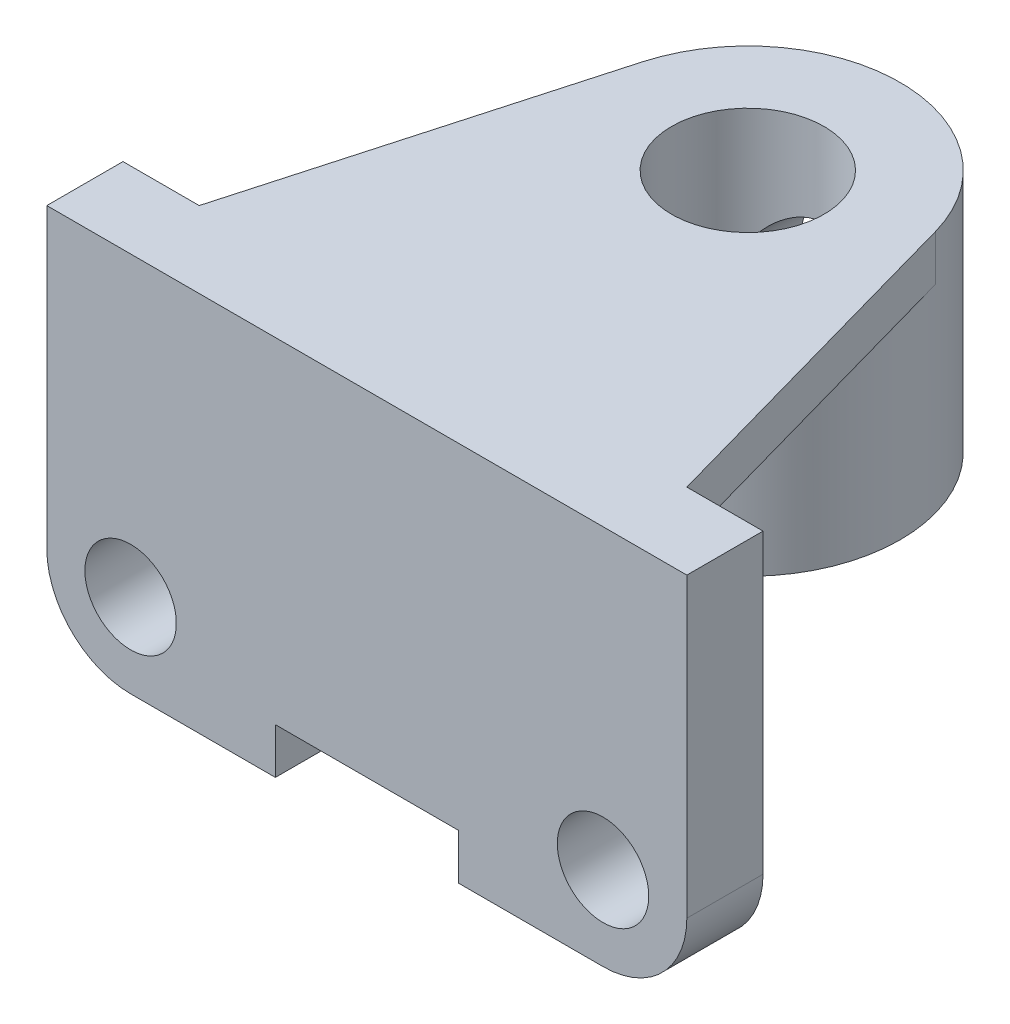
ISO-10303-21;
HEADER;
FILE_DESCRIPTION(('STEP AP214'),'2;1');
FILE_NAME('part.step','',(''),(''),'','','');
FILE_SCHEMA(('AUTOMOTIVE_DESIGN { 1 0 10303 214 1 1 1 1 }'));
ENDSEC;
DATA;
#1=APPLICATION_CONTEXT('core data for automotive mechanical design processes');
#2=APPLICATION_PROTOCOL_DEFINITION('international standard','automotive_design',2000,#1);
#3=PRODUCT_CONTEXT('',#1,'mechanical');
#4=PRODUCT('Part','Part','',(#3));
#5=PRODUCT_RELATED_PRODUCT_CATEGORY('part','',(#4));
#6=PRODUCT_DEFINITION_FORMATION('','',#4);
#7=PRODUCT_DEFINITION_CONTEXT('part definition',#1,'design');
#8=PRODUCT_DEFINITION('design','',#6,#7);
#9=PRODUCT_DEFINITION_SHAPE('','',#8);
#10=(LENGTH_UNIT() NAMED_UNIT(*) SI_UNIT(.MILLI.,.METRE.));
#11=(NAMED_UNIT(*) PLANE_ANGLE_UNIT() SI_UNIT($,.RADIAN.));
#12=(NAMED_UNIT(*) SI_UNIT($,.STERADIAN.) SOLID_ANGLE_UNIT());
#13=UNCERTAINTY_MEASURE_WITH_UNIT(LENGTH_MEASURE(1.E-05),#10,'distance_accuracy_value','');
#14=(GEOMETRIC_REPRESENTATION_CONTEXT(3) GLOBAL_UNCERTAINTY_ASSIGNED_CONTEXT((#13)) GLOBAL_UNIT_ASSIGNED_CONTEXT((#10,
#11,#12)) REPRESENTATION_CONTEXT('',''));
#15=CARTESIAN_POINT('',(0.,0.,0.));
#16=DIRECTION('',(0.,0.,1.));
#17=DIRECTION('',(1.,0.,0.));
#18=AXIS2_PLACEMENT_3D('',#15,#16,#17);
#19=CARTESIAN_POINT('',(31.,-39.,0.));
#20=DIRECTION('',(0.,0.,1.));
#21=DIRECTION('',(1.,0.,0.));
#22=AXIS2_PLACEMENT_3D('',#19,#20,#21);
#23=PLANE('',#22);
#24=CARTESIAN_POINT('',(31.,-39.,0.));
#25=DIRECTION('',(0.,0.,1.));
#26=DIRECTION('',(1.,0.,0.));
#27=AXIS2_PLACEMENT_3D('',#24,#25,#26);
#28=CIRCLE('',#27,6.);
#29=CARTESIAN_POINT('',(37.,-39.,0.));
#30=VERTEX_POINT('',#29);
#31=EDGE_CURVE('E318',#30,#30,#28,.T.);
#32=ORIENTED_EDGE('',*,*,#31,.T.);
#33=EDGE_LOOP('',(#32));
#34=FACE_BOUND('',#33,.T.);
#35=CARTESIAN_POINT('',(-31.,-39.,0.));
#36=DIRECTION('',(0.,0.,1.));
#37=DIRECTION('',(-1.,0.,0.));
#38=AXIS2_PLACEMENT_3D('',#35,#36,#37);
#39=CIRCLE('',#38,6.);
#40=CARTESIAN_POINT('',(-37.,-39.,0.));
#41=VERTEX_POINT('',#40);
#42=EDGE_CURVE('E309',#41,#41,#39,.T.);
#43=ORIENTED_EDGE('',*,*,#42,.T.);
#44=EDGE_LOOP('',(#43));
#45=FACE_BOUND('',#44,.T.);
#46=DIRECTION('',(0.,1.,0.));
#47=VECTOR('',#46,1.);
#48=CARTESIAN_POINT('',(3.00000000000001,-32.,0.));
#49=LINE('',#48,#47);
#50=CARTESIAN_POINT('',(3.00000000000001,-32.,0.));
#51=VERTEX_POINT('',#50);
#52=CARTESIAN_POINT('',(3.,-6.,0.));
#53=VERTEX_POINT('',#52);
#54=EDGE_CURVE('E359',#51,#53,#49,.T.);
#55=ORIENTED_EDGE('',*,*,#54,.T.);
#56=DIRECTION('',(-1.,0.,0.));
#57=VECTOR('',#56,1.);
#58=CARTESIAN_POINT('',(0.,-6.,0.));
#59=LINE('',#58,#57);
#60=CARTESIAN_POINT('',(32.,-6.,0.));
#61=VERTEX_POINT('',#60);
#62=EDGE_CURVE('E346',#61,#53,#59,.T.);
#63=ORIENTED_EDGE('',*,*,#62,.F.);
#64=DIRECTION('',(0.,1.,0.));
#65=VECTOR('',#64,1.);
#66=CARTESIAN_POINT('',(32.,-6.,0.));
#67=LINE('',#66,#65);
#68=CARTESIAN_POINT('',(32.,0.,0.));
#69=VERTEX_POINT('',#68);
#70=EDGE_CURVE('E334',#61,#69,#67,.T.);
#71=ORIENTED_EDGE('',*,*,#70,.T.);
#72=DIRECTION('',(-1.,0.,0.));
#73=VECTOR('',#72,1.);
#74=CARTESIAN_POINT('',(-42.,0.,0.));
#75=LINE('',#74,#73);
#76=CARTESIAN_POINT('',(42.,0.,0.));
#77=VERTEX_POINT('',#76);
#78=EDGE_CURVE('E184',#77,#69,#75,.T.);
#79=ORIENTED_EDGE('',*,*,#78,.F.);
#80=DIRECTION('',(0.,1.,0.));
#81=VECTOR('',#80,1.);
#82=CARTESIAN_POINT('',(42.,-39.,0.));
#83=LINE('',#82,#81);
#84=CARTESIAN_POINT('',(42.,-39.,0.));
#85=VERTEX_POINT('',#84);
#86=EDGE_CURVE('E179',#85,#77,#83,.T.);
#87=ORIENTED_EDGE('',*,*,#86,.F.);
#88=CARTESIAN_POINT('',(31.,-39.,0.));
#89=DIRECTION('',(0.,0.,1.));
#90=DIRECTION('',(1.,0.,0.));
#91=AXIS2_PLACEMENT_3D('',#88,#89,#90);
#92=CIRCLE('',#91,11.);
#93=CARTESIAN_POINT('',(31.,-50.,0.));
#94=VERTEX_POINT('',#93);
#95=EDGE_CURVE('E175',#94,#85,#92,.T.);
#96=ORIENTED_EDGE('',*,*,#95,.F.);
#97=DIRECTION('',(1.,0.,0.));
#98=VECTOR('',#97,1.);
#99=CARTESIAN_POINT('',(12.,-50.,0.));
#100=LINE('',#99,#98);
#101=CARTESIAN_POINT('',(12.,-50.,0.));
#102=VERTEX_POINT('',#101);
#103=EDGE_CURVE('E111',#102,#94,#100,.T.);
#104=ORIENTED_EDGE('',*,*,#103,.F.);
#105=DIRECTION('',(0.,-1.,0.));
#106=VECTOR('',#105,1.);
#107=CARTESIAN_POINT('',(12.,-50.,0.));
#108=LINE('',#107,#106);
#109=CARTESIAN_POINT('',(12.,-44.,0.));
#110=VERTEX_POINT('',#109);
#111=EDGE_CURVE('E202',#110,#102,#108,.T.);
#112=ORIENTED_EDGE('',*,*,#111,.F.);
#113=DIRECTION('',(1.,0.,0.));
#114=VECTOR('',#113,1.);
#115=CARTESIAN_POINT('',(-12.,-44.,0.));
#116=LINE('',#115,#114);
#117=CARTESIAN_POINT('',(-12.,-44.,0.));
#118=VERTEX_POINT('',#117);
#119=EDGE_CURVE('E160',#118,#110,#116,.T.);
#120=ORIENTED_EDGE('',*,*,#119,.F.);
#121=DIRECTION('',(0.,1.,0.));
#122=VECTOR('',#121,1.);
#123=CARTESIAN_POINT('',(-12.,-50.,0.));
#124=LINE('',#123,#122);
#125=CARTESIAN_POINT('',(-12.,-50.,0.));
#126=VERTEX_POINT('',#125);
#127=EDGE_CURVE('E197',#126,#118,#124,.T.);
#128=ORIENTED_EDGE('',*,*,#127,.F.);
#129=DIRECTION('',(1.,0.,0.));
#130=VECTOR('',#129,1.);
#131=CARTESIAN_POINT('',(-31.,-50.,0.));
#132=LINE('',#131,#130);
#133=CARTESIAN_POINT('',(-31.,-50.,0.));
#134=VERTEX_POINT('',#133);
#135=EDGE_CURVE('E194',#134,#126,#132,.T.);
#136=ORIENTED_EDGE('',*,*,#135,.F.);
#137=CARTESIAN_POINT('',(-31.,-39.,0.));
#138=DIRECTION('',(0.,0.,1.));
#139=DIRECTION('',(-1.,0.,0.));
#140=AXIS2_PLACEMENT_3D('',#137,#138,#139);
#141=CIRCLE('',#140,11.);
#142=CARTESIAN_POINT('',(-42.,-39.,0.));
#143=VERTEX_POINT('',#142);
#144=EDGE_CURVE('E191',#143,#134,#141,.T.);
#145=ORIENTED_EDGE('',*,*,#144,.F.);
#146=DIRECTION('',(0.,-1.,0.));
#147=VECTOR('',#146,1.);
#148=CARTESIAN_POINT('',(-42.,-39.,0.));
#149=LINE('',#148,#147);
#150=CARTESIAN_POINT('',(-42.,0.,0.));
#151=VERTEX_POINT('',#150);
#152=EDGE_CURVE('E188',#151,#143,#149,.T.);
#153=ORIENTED_EDGE('',*,*,#152,.F.);
#154=CARTESIAN_POINT('',(-32.,0.,0.));
#155=VERTEX_POINT('',#154);
#156=EDGE_CURVE('E183',#155,#151,#75,.T.);
#157=ORIENTED_EDGE('',*,*,#156,.F.);
#158=DIRECTION('',(0.,1.,0.));
#159=VECTOR('',#158,1.);
#160=CARTESIAN_POINT('',(-32.,-6.,0.));
#161=LINE('',#160,#159);
#162=CARTESIAN_POINT('',(-32.,-6.,0.));
#163=VERTEX_POINT('',#162);
#164=EDGE_CURVE('E305',#163,#155,#161,.T.);
#165=ORIENTED_EDGE('',*,*,#164,.F.);
#166=CARTESIAN_POINT('',(-3.,-6.,0.));
#167=VERTEX_POINT('',#166);
#168=EDGE_CURVE('E350',#167,#163,#59,.T.);
#169=ORIENTED_EDGE('',*,*,#168,.F.);
#170=DIRECTION('',(0.,1.,0.));
#171=VECTOR('',#170,1.);
#172=CARTESIAN_POINT('',(-3.,-32.,0.));
#173=LINE('',#172,#171);
#174=CARTESIAN_POINT('',(-3.,-32.,0.));
#175=VERTEX_POINT('',#174);
#176=EDGE_CURVE('E362',#175,#167,#173,.T.);
#177=ORIENTED_EDGE('',*,*,#176,.F.);
#178=DIRECTION('',(-1.,0.,0.));
#179=VECTOR('',#178,1.);
#180=CARTESIAN_POINT('',(0.,-32.,0.));
#181=LINE('',#180,#179);
#182=EDGE_CURVE('E379',#51,#175,#181,.T.);
#183=ORIENTED_EDGE('',*,*,#182,.F.);
#184=EDGE_LOOP('',(#55,#63,#71,#79,#87,#96,#104,#112,#120,#128,#136,#145,#153,#157,#165,#169,
#177,#183));
#185=FACE_BOUND('',#184,.T.);
#186=ADVANCED_FACE('F47',(#34,#45,#185),#23,.F.);
#187=CARTESIAN_POINT('',(0.,-6.,0.));
#188=DIRECTION('',(0.,1.,0.));
#189=DIRECTION('',(-1.,0.,0.));
#190=AXIS2_PLACEMENT_3D('',#187,#188,#189);
#191=PLANE('',#190);
#192=CARTESIAN_POINT('',(0.,-6.,-40.));
#193=DIRECTION('',(0.,1.,0.));
#194=DIRECTION('',(-1.,0.,0.));
#195=AXIS2_PLACEMENT_3D('',#192,#193,#194);
#196=CIRCLE('',#195,20.);
#197=CARTESIAN_POINT('',(-19.2558855153069,-6.,-45.4047084122455));
#198=VERTEX_POINT('',#197);
#199=CARTESIAN_POINT('',(-3.,-6.,-20.2262800667148));
#200=VERTEX_POINT('',#199);
#201=EDGE_CURVE('E56',#198,#200,#196,.T.);
#202=ORIENTED_EDGE('',*,*,#201,.T.);
#203=DIRECTION('',(0.,0.,1.));
#204=VECTOR('',#203,1.);
#205=CARTESIAN_POINT('',(-3.,-6.,0.));
#206=LINE('',#205,#204);
#207=EDGE_CURVE('E11',#200,#167,#206,.T.);
#208=ORIENTED_EDGE('',*,*,#207,.T.);
#209=ORIENTED_EDGE('',*,*,#168,.T.);
#210=DIRECTION('',(0.270235420612273,0.,-0.962794275765341));
#211=VECTOR('',#210,1.);
#212=CARTESIAN_POINT('',(-29.6631301582883,-6.,-8.32579571438513));
#213=LINE('',#212,#211);
#214=EDGE_CURVE('E261',#163,#198,#213,.T.);
#215=ORIENTED_EDGE('',*,*,#214,.T.);
#216=EDGE_LOOP('',(#202,#208,#209,#215));
#217=FACE_BOUND('',#216,.T.);
#218=ADVANCED_FACE('F254',(#217),#191,.F.);
#219=DIRECTION('',(0.,0.,1.));
#220=VECTOR('',#219,1.);
#221=CARTESIAN_POINT('',(3.,-6.,0.));
#222=LINE('',#221,#220);
#223=CARTESIAN_POINT('',(3.,-6.,-20.2262800667148));
#224=VERTEX_POINT('',#223);
#225=EDGE_CURVE('E241',#224,#53,#222,.T.);
#226=ORIENTED_EDGE('',*,*,#225,.F.);
#227=CARTESIAN_POINT('',(0.,-6.,-40.));
#228=DIRECTION('',(0.,1.,0.));
#229=DIRECTION('',(-1.,0.,0.));
#230=AXIS2_PLACEMENT_3D('',#227,#228,#229);
#231=CIRCLE('',#230,20.);
#232=CARTESIAN_POINT('',(19.2558855153068,-6.,-45.4047084122455));
#233=VERTEX_POINT('',#232);
#234=EDGE_CURVE('E237',#224,#233,#231,.T.);
#235=ORIENTED_EDGE('',*,*,#234,.T.);
#236=DIRECTION('',(-0.270235420612273,0.,-0.962794275765341));
#237=VECTOR('',#236,1.);
#238=CARTESIAN_POINT('',(29.6631301582883,-6.,-8.32579571438513));
#239=LINE('',#238,#237);
#240=EDGE_CURVE('E342',#61,#233,#239,.T.);
#241=ORIENTED_EDGE('',*,*,#240,.F.);
#242=ORIENTED_EDGE('',*,*,#62,.T.);
#243=EDGE_LOOP('',(#226,#235,#241,#242));
#244=FACE_BOUND('',#243,.T.);
#245=ADVANCED_FACE('F446',(#244),#191,.F.);
#246=CARTESIAN_POINT('',(31.,-39.,10.));
#247=DIRECTION('',(0.,0.,1.));
#248=DIRECTION('',(1.,0.,0.));
#249=AXIS2_PLACEMENT_3D('',#246,#247,#248);
#250=PLANE('',#249);
#251=CARTESIAN_POINT('',(31.,-39.,10.));
#252=DIRECTION('',(0.,0.,1.));
#253=DIRECTION('',(1.,0.,0.));
#254=AXIS2_PLACEMENT_3D('',#251,#252,#253);
#255=CIRCLE('',#254,6.);
#256=CARTESIAN_POINT('',(37.,-39.,10.));
#257=VERTEX_POINT('',#256);
#258=EDGE_CURVE('E180',#257,#257,#255,.T.);
#259=ORIENTED_EDGE('',*,*,#258,.F.);
#260=EDGE_LOOP('',(#259));
#261=FACE_BOUND('',#260,.T.);
#262=CARTESIAN_POINT('',(31.,-39.,10.));
#263=DIRECTION('',(0.,0.,1.));
#264=DIRECTION('',(1.,0.,0.));
#265=AXIS2_PLACEMENT_3D('',#262,#263,#264);
#266=CIRCLE('',#265,11.);
#267=CARTESIAN_POINT('',(31.,-50.,10.));
#268=VERTEX_POINT('',#267);
#269=CARTESIAN_POINT('',(42.,-39.,10.));
#270=VERTEX_POINT('',#269);
#271=EDGE_CURVE('E207',#268,#270,#266,.T.);
#272=ORIENTED_EDGE('',*,*,#271,.T.);
#273=DIRECTION('',(0.,1.,0.));
#274=VECTOR('',#273,1.);
#275=CARTESIAN_POINT('',(42.,-39.,10.));
#276=LINE('',#275,#274);
#277=CARTESIAN_POINT('',(42.,0.,10.));
#278=VERTEX_POINT('',#277);
#279=EDGE_CURVE('E120',#270,#278,#276,.T.);
#280=ORIENTED_EDGE('',*,*,#279,.T.);
#281=DIRECTION('',(-1.,0.,0.));
#282=VECTOR('',#281,1.);
#283=CARTESIAN_POINT('',(-42.,0.,10.));
#284=LINE('',#283,#282);
#285=CARTESIAN_POINT('',(-42.,0.,10.));
#286=VERTEX_POINT('',#285);
#287=EDGE_CURVE('E505',#278,#286,#284,.T.);
#288=ORIENTED_EDGE('',*,*,#287,.T.);
#289=DIRECTION('',(0.,-1.,0.));
#290=VECTOR('',#289,1.);
#291=CARTESIAN_POINT('',(-42.,-39.,10.));
#292=LINE('',#291,#290);
#293=CARTESIAN_POINT('',(-42.,-39.,10.));
#294=VERTEX_POINT('',#293);
#295=EDGE_CURVE('E749',#286,#294,#292,.T.);
#296=ORIENTED_EDGE('',*,*,#295,.T.);
#297=CARTESIAN_POINT('',(-31.,-39.,10.));
#298=DIRECTION('',(0.,0.,1.));
#299=DIRECTION('',(-1.,0.,0.));
#300=AXIS2_PLACEMENT_3D('',#297,#298,#299);
#301=CIRCLE('',#300,11.);
#302=CARTESIAN_POINT('',(-31.,-50.,10.));
#303=VERTEX_POINT('',#302);
#304=EDGE_CURVE('E753',#294,#303,#301,.T.);
#305=ORIENTED_EDGE('',*,*,#304,.T.);
#306=DIRECTION('',(1.,0.,0.));
#307=VECTOR('',#306,1.);
#308=CARTESIAN_POINT('',(-31.,-50.,10.));
#309=LINE('',#308,#307);
#310=CARTESIAN_POINT('',(-12.,-50.,10.));
#311=VERTEX_POINT('',#310);
#312=EDGE_CURVE('E760',#303,#311,#309,.T.);
#313=ORIENTED_EDGE('',*,*,#312,.T.);
#314=DIRECTION('',(0.,1.,0.));
#315=VECTOR('',#314,1.);
#316=CARTESIAN_POINT('',(-12.,-50.,10.));
#317=LINE('',#316,#315);
#318=CARTESIAN_POINT('',(-12.,-44.,10.));
#319=VERTEX_POINT('',#318);
#320=EDGE_CURVE('E150',#311,#319,#317,.T.);
#321=ORIENTED_EDGE('',*,*,#320,.T.);
#322=DIRECTION('',(1.,0.,0.));
#323=VECTOR('',#322,1.);
#324=CARTESIAN_POINT('',(-12.,-44.,10.));
#325=LINE('',#324,#323);
#326=CARTESIAN_POINT('',(12.,-44.,10.));
#327=VERTEX_POINT('',#326);
#328=EDGE_CURVE('E142',#319,#327,#325,.T.);
#329=ORIENTED_EDGE('',*,*,#328,.T.);
#330=DIRECTION('',(0.,-1.,0.));
#331=VECTOR('',#330,1.);
#332=CARTESIAN_POINT('',(12.,-50.,10.));
#333=LINE('',#332,#331);
#334=CARTESIAN_POINT('',(12.,-50.,10.));
#335=VERTEX_POINT('',#334);
#336=EDGE_CURVE('E147',#327,#335,#333,.T.);
#337=ORIENTED_EDGE('',*,*,#336,.T.);
#338=DIRECTION('',(1.,0.,0.));
#339=VECTOR('',#338,1.);
#340=CARTESIAN_POINT('',(12.,-50.,10.));
#341=LINE('',#340,#339);
#342=EDGE_CURVE('E72',#335,#268,#341,.T.);
#343=ORIENTED_EDGE('',*,*,#342,.T.);
#344=EDGE_LOOP('',(#272,#280,#288,#296,#305,#313,#321,#329,#337,#343));
#345=FACE_BOUND('',#344,.T.);
#346=CARTESIAN_POINT('',(-31.,-39.,10.));
#347=DIRECTION('',(0.,0.,1.));
#348=DIRECTION('',(-1.,0.,0.));
#349=AXIS2_PLACEMENT_3D('',#346,#347,#348);
#350=CIRCLE('',#349,6.);
#351=CARTESIAN_POINT('',(-37.,-39.,10.));
#352=VERTEX_POINT('',#351);
#353=EDGE_CURVE('E322',#352,#352,#350,.T.);
#354=ORIENTED_EDGE('',*,*,#353,.F.);
#355=EDGE_LOOP('',(#354));
#356=FACE_BOUND('',#355,.T.);
#357=ADVANCED_FACE('F144',(#261,#345,#356),#250,.T.);
#358=CARTESIAN_POINT('',(31.,-39.,10.));
#359=DIRECTION('',(0.,0.,-1.));
#360=DIRECTION('',(-1.,0.,0.));
#361=AXIS2_PLACEMENT_3D('',#358,#359,#360);
#362=CYLINDRICAL_SURFACE('',#361,11.);
#363=ORIENTED_EDGE('',*,*,#95,.T.);
#364=DIRECTION('',(0.,0.,-1.));
#365=VECTOR('',#364,1.);
#366=CARTESIAN_POINT('',(42.,-39.,10.));
#367=LINE('',#366,#365);
#368=EDGE_CURVE('E234',#270,#85,#367,.T.);
#369=ORIENTED_EDGE('',*,*,#368,.F.);
#370=ORIENTED_EDGE('',*,*,#271,.F.);
#371=DIRECTION('',(0.,0.,-1.));
#372=VECTOR('',#371,1.);
#373=CARTESIAN_POINT('',(31.,-50.,10.));
#374=LINE('',#373,#372);
#375=EDGE_CURVE('E171',#268,#94,#374,.T.);
#376=ORIENTED_EDGE('',*,*,#375,.T.);
#377=EDGE_LOOP('',(#363,#369,#370,#376));
#378=FACE_BOUND('',#377,.T.);
#379=ADVANCED_FACE('F49',(#378),#362,.T.);
#380=CARTESIAN_POINT('',(42.,-39.,10.));
#381=DIRECTION('',(-1.,0.,0.));
#382=DIRECTION('',(0.,-1.,0.));
#383=AXIS2_PLACEMENT_3D('',#380,#381,#382);
#384=PLANE('',#383);
#385=ORIENTED_EDGE('',*,*,#86,.T.);
#386=DIRECTION('',(0.,0.,-1.));
#387=VECTOR('',#386,1.);
#388=CARTESIAN_POINT('',(42.,0.,10.));
#389=LINE('',#388,#387);
#390=EDGE_CURVE('E230',#278,#77,#389,.T.);
#391=ORIENTED_EDGE('',*,*,#390,.F.);
#392=ORIENTED_EDGE('',*,*,#279,.F.);
#393=ORIENTED_EDGE('',*,*,#368,.T.);
#394=EDGE_LOOP('',(#385,#391,#392,#393));
#395=FACE_BOUND('',#394,.T.);
#396=ADVANCED_FACE('F495',(#395),#384,.F.);
#397=CARTESIAN_POINT('',(-42.,0.,10.));
#398=DIRECTION('',(0.,-1.,0.));
#399=DIRECTION('',(1.,0.,0.));
#400=AXIS2_PLACEMENT_3D('',#397,#398,#399);
#401=PLANE('',#400);
#402=CARTESIAN_POINT('',(0.,0.,-40.));
#403=DIRECTION('',(0.,1.,0.));
#404=DIRECTION('',(-1.,0.,0.));
#405=AXIS2_PLACEMENT_3D('',#402,#403,#404);
#406=CIRCLE('',#405,20.);
#407=CARTESIAN_POINT('',(19.2558855153068,0.,-45.4047084122455));
#408=VERTEX_POINT('',#407);
#409=CARTESIAN_POINT('',(-19.2558855153068,0.,-45.4047084122455));
#410=VERTEX_POINT('',#409);
#411=EDGE_CURVE('E293',#408,#410,#406,.T.);
#412=ORIENTED_EDGE('',*,*,#411,.T.);
#413=DIRECTION('',(0.270235420612273,0.,-0.962794275765341));
#414=VECTOR('',#413,1.);
#415=CARTESIAN_POINT('',(-29.6631301582883,0.,-8.32579571438513));
#416=LINE('',#415,#414);
#417=EDGE_CURVE('E294',#155,#410,#416,.T.);
#418=ORIENTED_EDGE('',*,*,#417,.F.);
#419=ORIENTED_EDGE('',*,*,#156,.T.);
#420=DIRECTION('',(0.,0.,-1.));
#421=VECTOR('',#420,1.);
#422=CARTESIAN_POINT('',(-42.,0.,10.));
#423=LINE('',#422,#421);
#424=EDGE_CURVE('E226',#286,#151,#423,.T.);
#425=ORIENTED_EDGE('',*,*,#424,.F.);
#426=ORIENTED_EDGE('',*,*,#287,.F.);
#427=ORIENTED_EDGE('',*,*,#390,.T.);
#428=ORIENTED_EDGE('',*,*,#78,.T.);
#429=DIRECTION('',(-0.270235420612273,0.,-0.962794275765341));
#430=VECTOR('',#429,1.);
#431=CARTESIAN_POINT('',(29.6631301582883,0.,-8.32579571438513));
#432=LINE('',#431,#430);
#433=EDGE_CURVE('E63',#69,#408,#432,.T.);
#434=ORIENTED_EDGE('',*,*,#433,.T.);
#435=EDGE_LOOP('',(#412,#418,#419,#425,#426,#427,#428,#434));
#436=FACE_BOUND('',#435,.T.);
#437=CARTESIAN_POINT('',(0.,0.,-40.));
#438=DIRECTION('',(0.,1.,0.));
#439=DIRECTION('',(-1.,0.,0.));
#440=AXIS2_PLACEMENT_3D('',#437,#438,#439);
#441=CIRCLE('',#440,10.);
#442=CARTESIAN_POINT('',(-10.,0.,-40.));
#443=VERTEX_POINT('',#442);
#444=EDGE_CURVE('E302',#443,#443,#441,.T.);
#445=ORIENTED_EDGE('',*,*,#444,.F.);
#446=EDGE_LOOP('',(#445));
#447=FACE_BOUND('',#446,.T.);
#448=ADVANCED_FACE('F296',(#436,#447),#401,.F.);
#449=CARTESIAN_POINT('',(-42.,-39.,10.));
#450=DIRECTION('',(1.,0.,0.));
#451=DIRECTION('',(0.,0.,-1.));
#452=AXIS2_PLACEMENT_3D('',#449,#450,#451);
#453=PLANE('',#452);
#454=ORIENTED_EDGE('',*,*,#152,.T.);
#455=DIRECTION('',(0.,0.,-1.));
#456=VECTOR('',#455,1.);
#457=CARTESIAN_POINT('',(-42.,-39.,10.));
#458=LINE('',#457,#456);
#459=EDGE_CURVE('E222',#294,#143,#458,.T.);
#460=ORIENTED_EDGE('',*,*,#459,.F.);
#461=ORIENTED_EDGE('',*,*,#295,.F.);
#462=ORIENTED_EDGE('',*,*,#424,.T.);
#463=EDGE_LOOP('',(#454,#460,#461,#462));
#464=FACE_BOUND('',#463,.T.);
#465=ADVANCED_FACE('F489',(#464),#453,.F.);
#466=CARTESIAN_POINT('',(-31.,-39.,10.));
#467=DIRECTION('',(0.,0.,-1.));
#468=DIRECTION('',(-1.,0.,0.));
#469=AXIS2_PLACEMENT_3D('',#466,#467,#468);
#470=CYLINDRICAL_SURFACE('',#469,11.);
#471=ORIENTED_EDGE('',*,*,#144,.T.);
#472=DIRECTION('',(0.,0.,-1.));
#473=VECTOR('',#472,1.);
#474=CARTESIAN_POINT('',(-31.,-50.,10.));
#475=LINE('',#474,#473);
#476=EDGE_CURVE('E218',#303,#134,#475,.T.);
#477=ORIENTED_EDGE('',*,*,#476,.F.);
#478=ORIENTED_EDGE('',*,*,#304,.F.);
#479=ORIENTED_EDGE('',*,*,#459,.T.);
#480=EDGE_LOOP('',(#471,#477,#478,#479));
#481=FACE_BOUND('',#480,.T.);
#482=ADVANCED_FACE('F485',(#481),#470,.T.);
#483=CARTESIAN_POINT('',(-31.,-50.,10.));
#484=DIRECTION('',(0.,1.,0.));
#485=DIRECTION('',(-1.,0.,0.));
#486=AXIS2_PLACEMENT_3D('',#483,#484,#485);
#487=PLANE('',#486);
#488=ORIENTED_EDGE('',*,*,#135,.T.);
#489=DIRECTION('',(0.,0.,-1.));
#490=VECTOR('',#489,1.);
#491=CARTESIAN_POINT('',(-12.,-50.,10.));
#492=LINE('',#491,#490);
#493=EDGE_CURVE('E214',#311,#126,#492,.T.);
#494=ORIENTED_EDGE('',*,*,#493,.F.);
#495=ORIENTED_EDGE('',*,*,#312,.F.);
#496=ORIENTED_EDGE('',*,*,#476,.T.);
#497=EDGE_LOOP('',(#488,#494,#495,#496));
#498=FACE_BOUND('',#497,.T.);
#499=ADVANCED_FACE('F481',(#498),#487,.F.);
#500=CARTESIAN_POINT('',(-12.,-50.,10.));
#501=DIRECTION('',(-1.,0.,0.));
#502=DIRECTION('',(0.,-1.,0.));
#503=AXIS2_PLACEMENT_3D('',#500,#501,#502);
#504=PLANE('',#503);
#505=ORIENTED_EDGE('',*,*,#127,.T.);
#506=DIRECTION('',(0.,0.,-1.));
#507=VECTOR('',#506,1.);
#508=CARTESIAN_POINT('',(-12.,-44.,10.));
#509=LINE('',#508,#507);
#510=EDGE_CURVE('E164',#319,#118,#509,.T.);
#511=ORIENTED_EDGE('',*,*,#510,.F.);
#512=ORIENTED_EDGE('',*,*,#320,.F.);
#513=ORIENTED_EDGE('',*,*,#493,.T.);
#514=EDGE_LOOP('',(#505,#511,#512,#513));
#515=FACE_BOUND('',#514,.T.);
#516=ADVANCED_FACE('F478',(#515),#504,.F.);
#517=CARTESIAN_POINT('',(-12.,-44.,10.));
#518=DIRECTION('',(0.,1.,0.));
#519=DIRECTION('',(0.,0.,1.));
#520=AXIS2_PLACEMENT_3D('',#517,#518,#519);
#521=PLANE('',#520);
#522=ORIENTED_EDGE('',*,*,#119,.T.);
#523=DIRECTION('',(0.,0.,-1.));
#524=VECTOR('',#523,1.);
#525=CARTESIAN_POINT('',(12.,-44.,10.));
#526=LINE('',#525,#524);
#527=EDGE_CURVE('E157',#327,#110,#526,.T.);
#528=ORIENTED_EDGE('',*,*,#527,.F.);
#529=ORIENTED_EDGE('',*,*,#328,.F.);
#530=ORIENTED_EDGE('',*,*,#510,.T.);
#531=EDGE_LOOP('',(#522,#528,#529,#530));
#532=FACE_BOUND('',#531,.T.);
#533=ADVANCED_FACE('F158',(#532),#521,.F.);
#534=CARTESIAN_POINT('',(12.,-50.,10.));
#535=DIRECTION('',(1.,0.,0.));
#536=DIRECTION('',(0.,1.,0.));
#537=AXIS2_PLACEMENT_3D('',#534,#535,#536);
#538=PLANE('',#537);
#539=ORIENTED_EDGE('',*,*,#111,.T.);
#540=DIRECTION('',(0.,0.,-1.));
#541=VECTOR('',#540,1.);
#542=CARTESIAN_POINT('',(12.,-50.,10.));
#543=LINE('',#542,#541);
#544=EDGE_CURVE('E165',#335,#102,#543,.T.);
#545=ORIENTED_EDGE('',*,*,#544,.F.);
#546=ORIENTED_EDGE('',*,*,#336,.F.);
#547=ORIENTED_EDGE('',*,*,#527,.T.);
#548=EDGE_LOOP('',(#539,#545,#546,#547));
#549=FACE_BOUND('',#548,.T.);
#550=ADVANCED_FACE('F167',(#549),#538,.F.);
#551=CARTESIAN_POINT('',(12.,-50.,10.));
#552=DIRECTION('',(0.,1.,0.));
#553=DIRECTION('',(0.,0.,1.));
#554=AXIS2_PLACEMENT_3D('',#551,#552,#553);
#555=PLANE('',#554);
#556=ORIENTED_EDGE('',*,*,#103,.T.);
#557=ORIENTED_EDGE('',*,*,#375,.F.);
#558=ORIENTED_EDGE('',*,*,#342,.F.);
#559=ORIENTED_EDGE('',*,*,#544,.T.);
#560=EDGE_LOOP('',(#556,#557,#558,#559));
#561=FACE_BOUND('',#560,.T.);
#562=ADVANCED_FACE('F464',(#561),#555,.F.);
#563=CARTESIAN_POINT('',(31.,-39.,10.));
#564=DIRECTION('',(0.,0.,-1.));
#565=DIRECTION('',(-1.,0.,0.));
#566=AXIS2_PLACEMENT_3D('',#563,#564,#565);
#567=CYLINDRICAL_SURFACE('',#566,6.);
#568=ORIENTED_EDGE('',*,*,#258,.T.);
#569=EDGE_LOOP('',(#568));
#570=FACE_BOUND('',#569,.T.);
#571=ORIENTED_EDGE('',*,*,#31,.F.);
#572=EDGE_LOOP('',(#571));
#573=FACE_BOUND('',#572,.T.);
#574=ADVANCED_FACE('F460',(#570,#573),#567,.F.);
#575=CARTESIAN_POINT('',(-31.,-39.,10.));
#576=DIRECTION('',(0.,0.,-1.));
#577=DIRECTION('',(-1.,0.,0.));
#578=AXIS2_PLACEMENT_3D('',#575,#576,#577);
#579=CYLINDRICAL_SURFACE('',#578,6.);
#580=ORIENTED_EDGE('',*,*,#353,.T.);
#581=EDGE_LOOP('',(#580));
#582=FACE_BOUND('',#581,.T.);
#583=ORIENTED_EDGE('',*,*,#42,.F.);
#584=EDGE_LOOP('',(#583));
#585=FACE_BOUND('',#584,.T.);
#586=ADVANCED_FACE('F453',(#582,#585),#579,.F.);
#587=CARTESIAN_POINT('',(-29.6631301582883,-6.,-8.32579571438513));
#588=DIRECTION('',(0.962794275765341,0.,0.270235420612273));
#589=DIRECTION('',(0.270235420612273,0.,-0.962794275765341));
#590=AXIS2_PLACEMENT_3D('',#587,#588,#589);
#591=PLANE('',#590);
#592=ORIENTED_EDGE('',*,*,#417,.T.);
#593=DIRECTION('',(0.,1.,0.));
#594=VECTOR('',#593,1.);
#595=CARTESIAN_POINT('',(-19.2558855153068,-6.,-45.4047084122455));
#596=LINE('',#595,#594);
#597=EDGE_CURVE('E272',#198,#410,#596,.T.);
#598=ORIENTED_EDGE('',*,*,#597,.F.);
#599=ORIENTED_EDGE('',*,*,#214,.F.);
#600=ORIENTED_EDGE('',*,*,#164,.T.);
#601=EDGE_LOOP('',(#592,#598,#599,#600));
#602=FACE_BOUND('',#601,.T.);
#603=ADVANCED_FACE('F306',(#602),#591,.F.);
#604=CARTESIAN_POINT('',(0.,-6.,-40.));
#605=DIRECTION('',(0.,1.,0.));
#606=DIRECTION('',(-1.,0.,0.));
#607=AXIS2_PLACEMENT_3D('',#604,#605,#606);
#608=CYLINDRICAL_SURFACE('',#607,20.);
#609=CARTESIAN_POINT('',(0.,-6.,-40.));
#610=DIRECTION('',(0.,1.,0.));
#611=DIRECTION('',(-1.,0.,0.));
#612=AXIS2_PLACEMENT_3D('',#609,#610,#611);
#613=CIRCLE('',#612,20.);
#614=CARTESIAN_POINT('',(13.228756555323,-6.,-55.));
#615=VERTEX_POINT('',#614);
#616=CARTESIAN_POINT('',(-13.228756555323,-6.,-55.));
#617=VERTEX_POINT('',#616);
#618=EDGE_CURVE('E339',#615,#617,#613,.T.);
#619=ORIENTED_EDGE('',*,*,#618,.T.);
#620=DIRECTION('',(0.,1.,0.));
#621=VECTOR('',#620,1.);
#622=CARTESIAN_POINT('',(-13.228756555323,-32.,-55.));
#623=LINE('',#622,#621);
#624=CARTESIAN_POINT('',(-13.228756555323,-32.,-55.));
#625=VERTEX_POINT('',#624);
#626=EDGE_CURVE('E367',#625,#617,#623,.T.);
#627=ORIENTED_EDGE('',*,*,#626,.F.);
#628=CARTESIAN_POINT('',(0.,-32.,-40.));
#629=DIRECTION('',(0.,1.,0.));
#630=DIRECTION('',(-1.,0.,0.));
#631=AXIS2_PLACEMENT_3D('',#628,#629,#630);
#632=CIRCLE('',#631,20.);
#633=CARTESIAN_POINT('',(-3.,-32.,-20.2262800667148));
#634=VERTEX_POINT('',#633);
#635=EDGE_CURVE('E387',#625,#634,#632,.T.);
#636=ORIENTED_EDGE('',*,*,#635,.T.);
#637=DIRECTION('',(0.,1.,0.));
#638=VECTOR('',#637,1.);
#639=CARTESIAN_POINT('',(-3.,-32.,-20.2262800667148));
#640=LINE('',#639,#638);
#641=EDGE_CURVE('E276',#634,#200,#640,.T.);
#642=ORIENTED_EDGE('',*,*,#641,.T.);
#643=ORIENTED_EDGE('',*,*,#201,.F.);
#644=ORIENTED_EDGE('',*,*,#597,.T.);
#645=ORIENTED_EDGE('',*,*,#411,.F.);
#646=DIRECTION('',(0.,1.,0.));
#647=VECTOR('',#646,1.);
#648=CARTESIAN_POINT('',(19.2558855153068,-6.,-45.4047084122455));
#649=LINE('',#648,#647);
#650=EDGE_CURVE('E331',#233,#408,#649,.T.);
#651=ORIENTED_EDGE('',*,*,#650,.F.);
#652=ORIENTED_EDGE('',*,*,#234,.F.);
#653=DIRECTION('',(0.,1.,0.));
#654=VECTOR('',#653,1.);
#655=CARTESIAN_POINT('',(3.,-32.,-20.2262800667148));
#656=LINE('',#655,#654);
#657=CARTESIAN_POINT('',(3.,-32.,-20.2262800667148));
#658=VERTEX_POINT('',#657);
#659=EDGE_CURVE('E375',#658,#224,#656,.T.);
#660=ORIENTED_EDGE('',*,*,#659,.F.);
#661=CARTESIAN_POINT('',(13.228756555323,-32.,-55.));
#662=VERTEX_POINT('',#661);
#663=EDGE_CURVE('E392',#658,#662,#632,.T.);
#664=ORIENTED_EDGE('',*,*,#663,.T.);
#665=DIRECTION('',(0.,1.,0.));
#666=VECTOR('',#665,1.);
#667=CARTESIAN_POINT('',(13.228756555323,-32.,-55.));
#668=LINE('',#667,#666);
#669=EDGE_CURVE('E371',#662,#615,#668,.T.);
#670=ORIENTED_EDGE('',*,*,#669,.T.);
#671=EDGE_LOOP('',(#619,#627,#636,#642,#643,#644,#645,#651,#652,#660,#664,#670));
#672=FACE_BOUND('',#671,.T.);
#673=ADVANCED_FACE('F269',(#672),#608,.T.);
#674=CARTESIAN_POINT('',(29.6631301582883,-6.,-8.32579571438513));
#675=DIRECTION('',(0.962794275765341,0.,-0.270235420612273));
#676=DIRECTION('',(-0.270235420612273,0.,-0.962794275765341));
#677=AXIS2_PLACEMENT_3D('',#674,#675,#676);
#678=PLANE('',#677);
#679=ORIENTED_EDGE('',*,*,#433,.F.);
#680=ORIENTED_EDGE('',*,*,#70,.F.);
#681=ORIENTED_EDGE('',*,*,#240,.T.);
#682=ORIENTED_EDGE('',*,*,#650,.T.);
#683=EDGE_LOOP('',(#679,#680,#681,#682));
#684=FACE_BOUND('',#683,.T.);
#685=ADVANCED_FACE('F449',(#684),#678,.T.);
#686=CARTESIAN_POINT('',(0.,-6.,-40.));
#687=DIRECTION('',(0.,1.,0.));
#688=DIRECTION('',(-1.,0.,0.));
#689=AXIS2_PLACEMENT_3D('',#686,#687,#688);
#690=CYLINDRICAL_SURFACE('',#689,10.);
#691=CARTESIAN_POINT('',(-8.,-19.,-46.));
#692=CARTESIAN_POINT('',(-7.99999850547057,-19.1502245973849,-46.0000035625211));
#693=CARTESIAN_POINT('',(-7.99575712002105,-19.3005041316017,-46.0056701147003));
#694=CARTESIAN_POINT('',(-7.97889190649411,-19.5998227625703,-46.028057010504));
#695=CARTESIAN_POINT('',(-7.96626236243051,-19.7488609432496,-46.0447848916728));
#696=CARTESIAN_POINT('',(-7.93287350748029,-20.0448722391957,-46.0885361116284));
#697=CARTESIAN_POINT('',(-7.91209363137079,-20.1918391486777,-46.1155854892796));
#698=CARTESIAN_POINT('',(-7.86281319571144,-20.4825420181236,-46.1788162695663));
#699=CARTESIAN_POINT('',(-7.83430749328153,-20.6262757565782,-46.2150037541004));
#700=CARTESIAN_POINT('',(-7.75884142962143,-20.9592881942781,-46.309133847231));
#701=CARTESIAN_POINT('',(-7.70891139176625,-21.1469945424797,-46.3702638264302));
#702=CARTESIAN_POINT('',(-7.59693100706947,-21.5146777395804,-46.5033987631141));
#703=CARTESIAN_POINT('',(-7.53488026634113,-21.6946543370537,-46.5754040739974));
#704=CARTESIAN_POINT('',(-7.39933665411533,-22.0472238559897,-46.7275717216712));
#705=CARTESIAN_POINT('',(-7.32581587966415,-22.2197974272986,-46.8077537806487));
#706=CARTESIAN_POINT('',(-7.16807370451545,-22.5571609407982,-46.9736527052382));
#707=CARTESIAN_POINT('',(-7.08385257539726,-22.72195108039,-47.059369430351));
#708=CARTESIAN_POINT('',(-6.87278634555154,-23.1021576930878,-47.2659318278601));
#709=CARTESIAN_POINT('',(-6.74154128211599,-23.3143314541059,-47.3882714394334));
#710=CARTESIAN_POINT('',(-6.46055204176311,-23.7247355264433,-47.6352012594411));
#711=CARTESIAN_POINT('',(-6.31080122510044,-23.9229607928642,-47.7597922618913));
#712=CARTESIAN_POINT('',(-5.99323431368263,-24.3049769032216,-48.0076016087498));
#713=CARTESIAN_POINT('',(-5.82543282445919,-24.4887792121506,-48.1308209752286));
#714=CARTESIAN_POINT('',(-5.47186088496404,-24.8413202959565,-48.3728499756174));
#715=CARTESIAN_POINT('',(-5.2860964524364,-25.0100640793945,-48.491661068008));
#716=CARTESIAN_POINT('',(-4.93523769395914,-25.2995587086947,-48.699217719499));
#717=CARTESIAN_POINT('',(-4.773300959646,-25.423208233294,-48.7892687769061));
#718=CARTESIAN_POINT('',(-4.43820831441266,-25.6591499982848,-48.9631422396163));
#719=CARTESIAN_POINT('',(-4.26505458459729,-25.7714444358219,-49.0469658490597));
#720=CARTESIAN_POINT('',(-3.90811229430165,-25.9835307817469,-49.2067828965185));
#721=CARTESIAN_POINT('',(-3.7243366131978,-26.0833373855595,-49.2827855190386));
#722=CARTESIAN_POINT('',(-3.34661343718592,-26.2694207254367,-49.4255459242732));
#723=CARTESIAN_POINT('',(-3.15266763681224,-26.3556997059609,-49.4923052403918));
#724=CARTESIAN_POINT('',(-2.78768994179331,-26.5007245521569,-49.6051625512352));
#725=CARTESIAN_POINT('',(-2.61802183428174,-26.5616666148699,-49.6528559822697));
#726=CARTESIAN_POINT('',(-2.27301580125696,-26.6724316798399,-49.7398681908194));
#727=CARTESIAN_POINT('',(-2.09767896323078,-26.7222568004452,-49.7791885637667));
#728=CARTESIAN_POINT('',(-1.7423528687864,-26.8101015378994,-49.8487037212126));
#729=CARTESIAN_POINT('',(-1.56236520089121,-26.8481251293834,-49.8789015779902));
#730=CARTESIAN_POINT('',(-1.19885362524063,-26.911813658384,-49.929573138509));
#731=CARTESIAN_POINT('',(-1.0153296752875,-26.9374784483307,-49.9500467261376));
#732=CARTESIAN_POINT('',(-0.645442904479309,-26.9760954696886,-49.9808798664654));
#733=CARTESIAN_POINT('',(-0.459072378956122,-26.98900275331,-49.9912036582981));
#734=CARTESIAN_POINT('',(-0.0855968189260255,-27.0017237925627,-50.0013783526599));
#735=CARTESIAN_POINT('',(0.101508216993088,-27.0015375230076,-50.0012292350435));
#736=CARTESIAN_POINT('',(0.474947204374592,-26.9880747033479,-49.9904615176309));
#737=CARTESIAN_POINT('',(0.661281129513559,-26.9747977100068,-49.9798425633384));
#738=CARTESIAN_POINT('',(1.0317009677617,-26.9353817867281,-49.9483739052354));
#739=CARTESIAN_POINT('',(1.21578693261968,-26.9092431534438,-49.9275244373914));
#740=CARTESIAN_POINT('',(1.57035549635709,-26.8463118196909,-49.8774625909737));
#741=CARTESIAN_POINT('',(1.74103055156827,-26.8101818492301,-49.8487714202642));
#742=CARTESIAN_POINT('',(2.07822216463014,-26.7272989213461,-49.7831747057938));
#743=CARTESIAN_POINT('',(2.24473728927077,-26.6805423572982,-49.7462663732471));
#744=CARTESIAN_POINT('',(2.57267278104258,-26.5769987362147,-49.6648788845584));
#745=CARTESIAN_POINT('',(2.73409423889292,-26.5202138439861,-49.6204013624463));
#746=CARTESIAN_POINT('',(3.05123215137682,-26.3972255670592,-49.5245718312793));
#747=CARTESIAN_POINT('',(3.20694649201474,-26.3310187358091,-49.4732173070197));
#748=CARTESIAN_POINT('',(3.6939296299468,-26.1056660599524,-49.299500025845));
#749=CARTESIAN_POINT('',(4.01344906782813,-25.9297286892284,-49.1654005550686));
#750=CARTESIAN_POINT('',(4.6189053975236,-25.5418137888386,-48.8757318004014));
#751=CARTESIAN_POINT('',(4.90482333755279,-25.329816083958,-48.7201505069779));
#752=CARTESIAN_POINT('',(5.33520078810717,-24.9649556248804,-48.4599931051072));
#753=CARTESIAN_POINT('',(5.49079696244521,-24.8219768002602,-48.3596542542938));
#754=CARTESIAN_POINT('',(5.78920834677225,-24.525334785537,-48.1558378737339));
#755=CARTESIAN_POINT('',(5.93202522428543,-24.3716729940789,-48.0523607558548));
#756=CARTESIAN_POINT('',(6.20495908338477,-24.0539498656668,-47.8439788220106));
#757=CARTESIAN_POINT('',(6.33505914332126,-23.8898751386548,-47.7390723098274));
#758=CARTESIAN_POINT('',(6.58220317054509,-23.5517525979076,-47.5299923086413));
#759=CARTESIAN_POINT('',(6.69924870134031,-23.3777059822679,-47.4258187332597));
#760=CARTESIAN_POINT('',(6.90938493162869,-23.03689456897,-47.2304188739501));
#761=CARTESIAN_POINT('',(7.0036970996744,-22.8710437484325,-47.1389121545167));
#762=CARTESIAN_POINT('',(7.18111377588424,-22.5310600355781,-46.9604190506679));
#763=CARTESIAN_POINT('',(7.26421700200963,-22.3569261989551,-46.8734331840298));
#764=CARTESIAN_POINT('',(7.41852221314823,-22.0005237104796,-46.7065951360486));
#765=CARTESIAN_POINT('',(7.48974437690969,-21.8182695314326,-46.6267309688985));
#766=CARTESIAN_POINT('',(7.61961784585522,-21.4454908329933,-46.4769774082942));
#767=CARTESIAN_POINT('',(7.67827490034183,-21.2549701442279,-46.4070834577709));
#768=CARTESIAN_POINT('',(7.802468138106,-20.7888818626535,-46.2557630735838));
#769=CARTESIAN_POINT('',(7.8616140196444,-20.5093731761699,-46.1806373561221));
#770=CARTESIAN_POINT('',(7.92785703981829,-20.0816376872895,-46.0951092926614));
#771=CARTESIAN_POINT('',(7.94618750700997,-19.9377422207977,-46.0711333875207));
#772=CARTESIAN_POINT('',(7.97505562335785,-19.6478230365839,-46.0331640805168));
#773=CARTESIAN_POINT('',(7.98559344384276,-19.5017993657245,-46.0191704591838));
#774=CARTESIAN_POINT('',(7.99865927125614,-19.2078949001094,-46.0017972707818));
#775=CARTESIAN_POINT('',(8.00113968070391,-19.0600082318572,-45.9984807776521));
#776=CARTESIAN_POINT('',(7.99789775429116,-18.7644891935703,-46.0028025366031));
#777=CARTESIAN_POINT('',(7.99217554947408,-18.6168568195108,-46.0104406136757));
#778=CARTESIAN_POINT('',(7.97265920777897,-18.3229303711516,-46.0363038081906));
#779=CARTESIAN_POINT('',(7.95885728951073,-18.1766377252474,-46.0545391314788));
#780=CARTESIAN_POINT('',(7.92347678294739,-17.8864925234792,-46.1007668881754));
#781=CARTESIAN_POINT('',(7.90189335304496,-17.7426415452811,-46.1287653958187));
#782=CARTESIAN_POINT('',(7.84493960984964,-17.4221172033272,-46.2015776331507));
#783=CARTESIAN_POINT('',(7.80746054479984,-17.2463785380863,-46.2488554893154));
#784=CARTESIAN_POINT('',(7.72176071100922,-16.9009227683318,-46.3544491243248));
#785=CARTESIAN_POINT('',(7.6735345432082,-16.731208740292,-46.4127704488948));
#786=CARTESIAN_POINT('',(7.56699838694255,-16.3978410251196,-46.5381428785033));
#787=CARTESIAN_POINT('',(7.50866488429104,-16.2342025751684,-46.6052142481052));
#788=CARTESIAN_POINT('',(7.38261988831835,-15.913478412523,-46.7458021111638));
#789=CARTESIAN_POINT('',(7.31490797291798,-15.7563929951648,-46.8193188946443));
#790=CARTESIAN_POINT('',(7.13750913219513,-15.3782073008853,-47.0056551577577));
#791=CARTESIAN_POINT('',(7.02279764848337,-15.1607250324744,-47.1210590295198));
#792=CARTESIAN_POINT('',(6.77531704020675,-14.7391495942116,-47.3569253304349));
#793=CARTESIAN_POINT('',(6.64254050094867,-14.5350619733674,-47.4773898225818));
#794=CARTESIAN_POINT('',(6.35927652866585,-14.1400919711788,-47.7197399713579));
#795=CARTESIAN_POINT('',(6.20877175975431,-13.9492228101971,-47.8416269122779));
#796=CARTESIAN_POINT('',(5.89040753321111,-13.5813044026241,-48.0835060679972));
#797=CARTESIAN_POINT('',(5.72255079321845,-13.4042529995167,-48.2034985761165));
#798=CARTESIAN_POINT('',(5.3670650550418,-13.0622985828578,-48.4404321398181));
#799=CARTESIAN_POINT('',(5.17918701450816,-12.8976062146386,-48.5573047517753));
#800=CARTESIAN_POINT('',(4.78588595979406,-12.5845137487009,-48.7833215523416));
#801=CARTESIAN_POINT('',(4.58046020874131,-12.4361162007237,-48.892464530506));
#802=CARTESIAN_POINT('',(4.15319348553334,-12.1577921372172,-49.0998475373332));
#803=CARTESIAN_POINT('',(3.93139916922695,-12.0278159883959,-49.1981167004931));
#804=CARTESIAN_POINT('',(3.47195618236025,-11.788026312432,-49.3811817155991));
#805=CARTESIAN_POINT('',(3.23431659302677,-11.6782013693892,-49.4659851923301));
#806=CARTESIAN_POINT('',(2.82388510571559,-11.5128350540332,-49.5945759517856));
#807=CARTESIAN_POINT('',(2.65489537054561,-11.4512096246717,-49.642770936533));
#808=CARTESIAN_POINT('',(2.31120271030773,-11.3389951806792,-49.7308675927928));
#809=CARTESIAN_POINT('',(2.13650128662404,-11.2884032921511,-49.7707714237665));
#810=CARTESIAN_POINT('',(1.78241638140578,-11.1989539823414,-49.8415227900793));
#811=CARTESIAN_POINT('',(1.6030354339024,-11.1600903476835,-49.8723751204665));
#812=CARTESIAN_POINT('',(1.24064885437532,-11.0946418023134,-49.9244291587178));
#813=CARTESIAN_POINT('',(1.05764309373695,-11.068057328104,-49.9456305235066));
#814=CARTESIAN_POINT('',(0.688660273637501,-11.0275274044886,-49.9779842336916));
#815=CARTESIAN_POINT('',(0.502674742837961,-11.0136289477007,-49.9890992153786));
#816=CARTESIAN_POINT('',(0.129854802408139,-10.9988788670188,-50.0008959415595));
#817=CARTESIAN_POINT('',(-0.0569796038491151,-10.9980271913285,-50.0015777274738));
#818=CARTESIAN_POINT('',(-0.430005030742399,-11.0093855893547,-49.9924925426944));
#819=CARTESIAN_POINT('',(-0.616196009410918,-11.0215964995269,-49.9827249028773));
#820=CARTESIAN_POINT('',(-0.9864520851036,-11.0588708727491,-49.9529596623736));
#821=CARTESIAN_POINT('',(-1.17051722858032,-11.0839340544129,-49.9329622856556));
#822=CARTESIAN_POINT('',(-1.52534233748454,-11.1448123664376,-49.8845158147891));
#823=CARTESIAN_POINT('',(-1.69628523757394,-11.1799762532287,-49.8565794972966));
#824=CARTESIAN_POINT('',(-2.0340973654798,-11.2609670388243,-49.7924470852477));
#825=CARTESIAN_POINT('',(-2.20096518428782,-11.3067975696493,-49.7562481773385));
#826=CARTESIAN_POINT('',(-2.52967809365013,-11.4085364483185,-49.6762250101504));
#827=CARTESIAN_POINT('',(-2.69152422691808,-11.4644426873825,-49.6324023465403));
#828=CARTESIAN_POINT('',(-3.00956874161385,-11.5857232336464,-49.5378229780351));
#829=CARTESIAN_POINT('',(-3.16576502616878,-11.6511010119375,-49.4870637314376));
#830=CARTESIAN_POINT('',(-3.65335383729774,-11.8734303829591,-49.3154984645699));
#831=CARTESIAN_POINT('',(-3.97317038012611,-12.0471409654379,-49.1829254602791));
#832=CARTESIAN_POINT('',(-4.57952585479548,-12.4306037697017,-48.8961062444394));
#833=CARTESIAN_POINT('',(-4.86604698218988,-12.6403751273984,-48.7418485337057));
#834=CARTESIAN_POINT('',(-5.29741387615485,-13.001488375582,-48.4837007576163));
#835=CARTESIAN_POINT('',(-5.45332719334461,-13.1429406531992,-48.3841433189764));
#836=CARTESIAN_POINT('',(-5.75249575586661,-13.436484403649,-48.1817714471187));
#837=CARTESIAN_POINT('',(-5.8957526253861,-13.5885745068405,-48.0789574341205));
#838=CARTESIAN_POINT('',(-6.16969303597326,-13.903094460445,-47.8717485393969));
#839=CARTESIAN_POINT('',(-6.30035965956407,-14.0655377488514,-47.7673517428858));
#840=CARTESIAN_POINT('',(-6.54877096921903,-14.4003213834257,-47.5590908349388));
#841=CARTESIAN_POINT('',(-6.66651708433833,-14.5726606318461,-47.4552266658062));
#842=CARTESIAN_POINT('',(-6.87986147468855,-14.9128861360897,-47.2585687919264));
#843=CARTESIAN_POINT('',(-6.97648055700592,-15.080007175603,-47.165558655438));
#844=CARTESIAN_POINT('',(-7.1582698595281,-15.4227379491246,-46.9839583212164));
#845=CARTESIAN_POINT('',(-7.24343854865576,-15.5983488140811,-46.8953687155636));
#846=CARTESIAN_POINT('',(-7.40164833259944,-15.9579387232047,-46.7252564635126));
#847=CARTESIAN_POINT('',(-7.47470603996769,-16.1419058560644,-46.6437242112386));
#848=CARTESIAN_POINT('',(-7.60800017607482,-16.5184337390734,-46.4906571295285));
#849=CARTESIAN_POINT('',(-7.66824305135968,-16.7109901091192,-46.4191172796288));
#850=CARTESIAN_POINT('',(-7.75905938511667,-17.0461365909884,-46.3087633834062));
#851=CARTESIAN_POINT('',(-7.79313760396692,-17.1866548140204,-46.2665291648308));
#852=CARTESIAN_POINT('',(-7.85395376355246,-17.4714098563896,-46.1901369919028));
#853=CARTESIAN_POINT('',(-7.88069427981941,-17.6156453514697,-46.1559762043637));
#854=CARTESIAN_POINT('',(-7.92632124595051,-17.9068033632997,-46.0971156563688));
#855=CARTESIAN_POINT('',(-7.94523144943217,-18.0537163208621,-46.0723873004537));
#856=CARTESIAN_POINT('',(-7.97490856466575,-18.3496804182298,-46.0333610017497));
#857=CARTESIAN_POINT('',(-7.98568117830565,-18.4987299861868,-46.0190557558922));
#858=CARTESIAN_POINT('',(-7.99483909530783,-18.7067633952093,-46.0068760517793));
#859=CARTESIAN_POINT('',(-7.99677323072384,-18.7653574608484,-46.0043003575955));
#860=CARTESIAN_POINT('',(-7.99935405881775,-18.8826315493017,-46.0008615243307));
#861=CARTESIAN_POINT('',(-8.00000058386954,-18.9413115823126,-45.9999986082258));
#862=CARTESIAN_POINT('',(-8.,-19.,-46.));
#863=B_SPLINE_CURVE_WITH_KNOTS('',3,(#691,#692,#693,#694,#695,#696,#697,#698,#699,#700,#701,
#702,#703,#704,#705,#706,#707,#708,#709,#710,#711,#712,#713,#714,#715,#716,#717,#718,#719,#720,
#721,#722,#723,#724,#725,#726,#727,#728,#729,#730,#731,#732,#733,#734,#735,#736,#737,#738,#739,
#740,#741,#742,#743,#744,#745,#746,#747,#748,#749,#750,#751,#752,#753,#754,#755,#756,#757,#758,
#759,#760,#761,#762,#763,#764,#765,#766,#767,#768,#769,#770,#771,#772,#773,#774,#775,#776,#777,
#778,#779,#780,#781,#782,#783,#784,#785,#786,#787,#788,#789,#790,#791,#792,#793,#794,#795,#796,
#797,#798,#799,#800,#801,#802,#803,#804,#805,#806,#807,#808,#809,#810,#811,#812,#813,#814,#815,
#816,#817,#818,#819,#820,#821,#822,#823,#824,#825,#826,#827,#828,#829,#830,#831,#832,#833,#834,
#835,#836,#837,#838,#839,#840,#841,#842,#843,#844,#845,#846,#847,#848,#849,#850,#851,#852,#853,
#854,#855,#856,#857,#858,#859,#860,#861,#862),.UNSPECIFIED.,.T.,.F.,(4,2,2,2,2,2,2,2,2,2,2,2,2,
2,2,2,2,2,2,2,2,2,2,2,2,2,2,2,2,2,2,2,2,2,2,2,2,2,2,2,2,2,2,2,2,2,2,2,2,2,2,2,2,2,2,2,2,2,2,2,2,
2,2,2,2,2,2,2,2,2,2,2,2,2,2,2,2,2,2,2,2,2,2,2,2,4),(0.,0.450606299614462,0.901519973676548,
1.35357880611544,1.80593930452559,2.41584789433293,3.02577630765048,3.63721230982387,
4.2486327966023,5.08116194685192,5.91399067523193,6.74615052600714,7.57803255543161,
8.24571319317796,8.91326439024935,9.5800224870579,10.2466698401778,10.8055557245148,
11.3643350212721,11.9229259221237,12.4815234926587,13.0420821963222,13.6026419782702,
14.1632207407637,14.7237865741235,15.2536171560135,15.7836278295952,16.3135242297491,
16.8436149670074,18.0049267579594,19.1668904354683,19.8681109783519,20.5692398876651,
21.2712894046784,21.9732547485046,22.6075897572729,23.2419972576007,23.875316063926,
24.5083444664164,25.3907054643292,25.8313204999235,26.2719258478914,26.7151292918451,
27.1583256553426,27.6019495551256,28.045849952592,28.6024005613437,29.1592313992438,
29.7173755088329,30.2755447460869,31.0892572695395,31.9033047896381,32.7181550553137,
33.5328778931948,34.3592852448838,35.1858217254169,36.0100870934492,36.8338840537071,
37.3920107728034,37.9499919430164,38.5076769857722,39.0653818517365,39.6251443288452,
40.1849045836663,40.7447006845826,41.3044845299156,41.8341418130277,42.363979710385,
42.89370684462,43.4236286045014,44.5810964856001,45.7391804922371,46.4372454590117,
47.135220713401,47.8341211250874,48.5329441577693,49.1753059573188,49.8177535643469,
50.459312504776,51.1005479394881,51.5520690389132,52.0034314512373,52.453414422329,
52.9030818038455,53.0790977765727,53.255136662246),.UNSPECIFIED.);
#864=CARTESIAN_POINT('',(-8.,-19.,-46.));
#865=VERTEX_POINT('',#864);
#866=EDGE_CURVE('E405',#865,#865,#863,.T.);
#867=ORIENTED_EDGE('',*,*,#866,.F.);
#868=EDGE_LOOP('',(#867));
#869=FACE_BOUND('',#868,.T.);
#870=ORIENTED_EDGE('',*,*,#444,.T.);
#871=EDGE_LOOP('',(#870));
#872=FACE_BOUND('',#871,.T.);
#873=CARTESIAN_POINT('',(0.,-32.,-40.));
#874=DIRECTION('',(0.,1.,0.));
#875=DIRECTION('',(-1.,0.,0.));
#876=AXIS2_PLACEMENT_3D('',#873,#874,#875);
#877=CIRCLE('',#876,10.);
#878=CARTESIAN_POINT('',(-10.,-32.,-40.));
#879=VERTEX_POINT('',#878);
#880=EDGE_CURVE('E401',#879,#879,#877,.T.);
#881=ORIENTED_EDGE('',*,*,#880,.F.);
#882=EDGE_LOOP('',(#881));
#883=FACE_BOUND('',#882,.T.);
#884=ADVANCED_FACE('F444',(#869,#872,#883),#690,.F.);
#885=ORIENTED_EDGE('',*,*,#618,.F.);
#886=DIRECTION('',(-1.,0.,0.));
#887=VECTOR('',#886,1.);
#888=CARTESIAN_POINT('',(0.,-6.,-55.));
#889=LINE('',#888,#887);
#890=EDGE_CURVE('E245',#615,#617,#889,.T.);
#891=ORIENTED_EDGE('',*,*,#890,.T.);
#892=EDGE_LOOP('',(#885,#891));
#893=FACE_BOUND('',#892,.T.);
#894=ADVANCED_FACE('F440',(#893),#191,.F.);
#895=CARTESIAN_POINT('',(3.00000000000001,-32.,0.));
#896=DIRECTION('',(-1.,0.,0.));
#897=DIRECTION('',(0.,-1.,0.));
#898=AXIS2_PLACEMENT_3D('',#895,#896,#897);
#899=PLANE('',#898);
#900=ORIENTED_EDGE('',*,*,#659,.T.);
#901=ORIENTED_EDGE('',*,*,#225,.T.);
#902=ORIENTED_EDGE('',*,*,#54,.F.);
#903=DIRECTION('',(0.,0.,1.));
#904=VECTOR('',#903,1.);
#905=CARTESIAN_POINT('',(3.00000000000001,-32.,0.));
#906=LINE('',#905,#904);
#907=EDGE_CURVE('E398',#658,#51,#906,.T.);
#908=ORIENTED_EDGE('',*,*,#907,.F.);
#909=EDGE_LOOP('',(#900,#901,#902,#908));
#910=FACE_BOUND('',#909,.T.);
#911=ADVANCED_FACE('F433',(#910),#899,.F.);
#912=CARTESIAN_POINT('',(-3.,-32.,0.));
#913=DIRECTION('',(-1.,0.,0.));
#914=DIRECTION('',(0.,-1.,0.));
#915=AXIS2_PLACEMENT_3D('',#912,#913,#914);
#916=PLANE('',#915);
#917=ORIENTED_EDGE('',*,*,#207,.F.);
#918=ORIENTED_EDGE('',*,*,#641,.F.);
#919=DIRECTION('',(0.,0.,1.));
#920=VECTOR('',#919,1.);
#921=CARTESIAN_POINT('',(-3.,-32.,0.));
#922=LINE('',#921,#920);
#923=EDGE_CURVE('E383',#634,#175,#922,.T.);
#924=ORIENTED_EDGE('',*,*,#923,.T.);
#925=ORIENTED_EDGE('',*,*,#176,.T.);
#926=EDGE_LOOP('',(#917,#918,#924,#925));
#927=FACE_BOUND('',#926,.T.);
#928=ADVANCED_FACE('F430',(#927),#916,.T.);
#929=CARTESIAN_POINT('',(0.,-32.,-55.));
#930=DIRECTION('',(0.,0.,-1.));
#931=DIRECTION('',(-1.,0.,0.));
#932=AXIS2_PLACEMENT_3D('',#929,#930,#931);
#933=PLANE('',#932);
#934=CARTESIAN_POINT('',(0.,-19.,-55.));
#935=DIRECTION('',(0.,0.,-1.));
#936=DIRECTION('',(-1.,0.,0.));
#937=AXIS2_PLACEMENT_3D('',#934,#935,#936);
#938=CIRCLE('',#937,8.);
#939=CARTESIAN_POINT('',(-8.,-19.,-55.));
#940=VERTEX_POINT('',#939);
#941=EDGE_CURVE('E409',#940,#940,#938,.T.);
#942=ORIENTED_EDGE('',*,*,#941,.F.);
#943=EDGE_LOOP('',(#942));
#944=FACE_BOUND('',#943,.T.);
#945=ORIENTED_EDGE('',*,*,#890,.F.);
#946=ORIENTED_EDGE('',*,*,#669,.F.);
#947=DIRECTION('',(-1.,0.,0.));
#948=VECTOR('',#947,1.);
#949=CARTESIAN_POINT('',(0.,-32.,-55.));
#950=LINE('',#949,#948);
#951=EDGE_CURVE('E390',#662,#625,#950,.T.);
#952=ORIENTED_EDGE('',*,*,#951,.T.);
#953=ORIENTED_EDGE('',*,*,#626,.T.);
#954=EDGE_LOOP('',(#945,#946,#952,#953));
#955=FACE_BOUND('',#954,.T.);
#956=ADVANCED_FACE('F428',(#944,#955),#933,.T.);
#957=CARTESIAN_POINT('',(0.,-32.,0.));
#958=DIRECTION('',(0.,1.,0.));
#959=DIRECTION('',(-1.,0.,0.));
#960=AXIS2_PLACEMENT_3D('',#957,#958,#959);
#961=PLANE('',#960);
#962=ORIENTED_EDGE('',*,*,#880,.T.);
#963=EDGE_LOOP('',(#962));
#964=FACE_BOUND('',#963,.T.);
#965=ORIENTED_EDGE('',*,*,#907,.T.);
#966=ORIENTED_EDGE('',*,*,#182,.T.);
#967=ORIENTED_EDGE('',*,*,#923,.F.);
#968=ORIENTED_EDGE('',*,*,#635,.F.);
#969=ORIENTED_EDGE('',*,*,#951,.F.);
#970=ORIENTED_EDGE('',*,*,#663,.F.);
#971=EDGE_LOOP('',(#965,#966,#967,#968,#969,#970));
#972=FACE_BOUND('',#971,.T.);
#973=ADVANCED_FACE('F425',(#964,#972),#961,.F.);
#974=CARTESIAN_POINT('',(0.,-19.,10.001));
#975=DIRECTION('',(0.,0.,-1.));
#976=DIRECTION('',(-1.,0.,0.));
#977=AXIS2_PLACEMENT_3D('',#974,#975,#976);
#978=CYLINDRICAL_SURFACE('',#977,8.);
#979=ORIENTED_EDGE('',*,*,#941,.T.);
#980=EDGE_LOOP('',(#979));
#981=FACE_BOUND('',#980,.T.);
#982=ORIENTED_EDGE('',*,*,#866,.T.);
#983=EDGE_LOOP('',(#982));
#984=FACE_BOUND('',#983,.T.);
#985=ADVANCED_FACE('F420',(#981,#984),#978,.F.);
#986=CLOSED_SHELL('',(#186,#218,#245,#357,#379,#396,#448,#465,#482,#499,#516,#533,#550,#562,
#574,#586,#603,#673,#685,#884,#894,#911,#928,#956,#973,#985));
#987=MANIFOLD_SOLID_BREP('B2',#986);
#988=ADVANCED_BREP_SHAPE_REPRESENTATION('',(#18,#987),#14);
#989=SHAPE_DEFINITION_REPRESENTATION(#9,#988);
ENDSEC;
END-ISO-10303-21;
